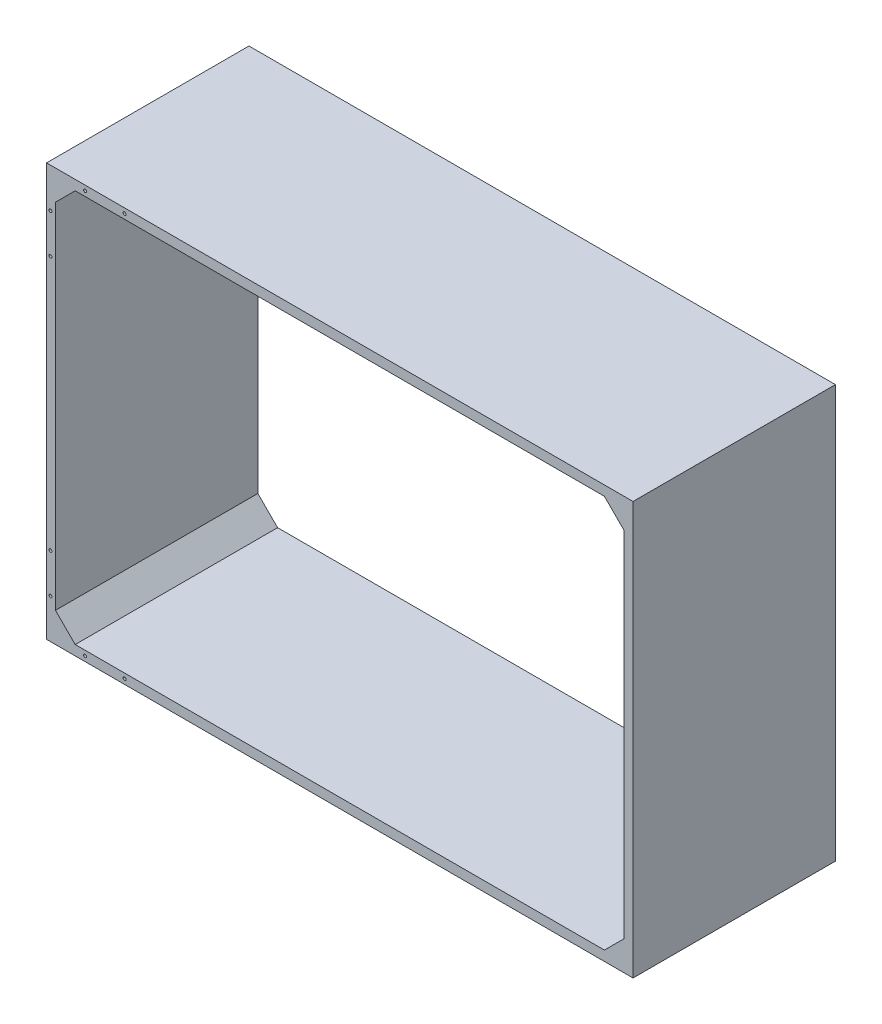
ISO-10303-21;
HEADER;
FILE_DESCRIPTION(('STEP AP214'),'2;1');
FILE_NAME('part.step','',(''),(''),'','','');
FILE_SCHEMA(('AUTOMOTIVE_DESIGN { 1 0 10303 214 1 1 1 1 }'));
ENDSEC;
DATA;
#1=APPLICATION_CONTEXT('core data for automotive mechanical design processes');
#2=APPLICATION_PROTOCOL_DEFINITION('international standard','automotive_design',2000,#1);
#3=PRODUCT_CONTEXT('',#1,'mechanical');
#4=PRODUCT('Part','Part','',(#3));
#5=PRODUCT_RELATED_PRODUCT_CATEGORY('part','',(#4));
#6=PRODUCT_DEFINITION_FORMATION('','',#4);
#7=PRODUCT_DEFINITION_CONTEXT('part definition',#1,'design');
#8=PRODUCT_DEFINITION('design','',#6,#7);
#9=PRODUCT_DEFINITION_SHAPE('','',#8);
#10=(LENGTH_UNIT() NAMED_UNIT(*) SI_UNIT(.MILLI.,.METRE.));
#11=(NAMED_UNIT(*) PLANE_ANGLE_UNIT() SI_UNIT($,.RADIAN.));
#12=(NAMED_UNIT(*) SI_UNIT($,.STERADIAN.) SOLID_ANGLE_UNIT());
#13=UNCERTAINTY_MEASURE_WITH_UNIT(LENGTH_MEASURE(1.E-05),#10,'distance_accuracy_value','');
#14=(GEOMETRIC_REPRESENTATION_CONTEXT(3) GLOBAL_UNCERTAINTY_ASSIGNED_CONTEXT((#13)) GLOBAL_UNIT_ASSIGNED_CONTEXT((#10,
#11,#12)) REPRESENTATION_CONTEXT('',''));
#15=CARTESIAN_POINT('',(0.,0.,0.));
#16=DIRECTION('',(0.,0.,1.));
#17=DIRECTION('',(1.,0.,0.));
#18=AXIS2_PLACEMENT_3D('',#15,#16,#17);
#19=CARTESIAN_POINT('',(-297.,-209.,0.));
#20=DIRECTION('',(-1.,0.,0.));
#21=DIRECTION('',(0.,0.,1.));
#22=AXIS2_PLACEMENT_3D('',#19,#20,#21);
#23=PLANE('',#22);
#24=DIRECTION('',(0.,1.,0.));
#25=VECTOR('',#24,1.);
#26=CARTESIAN_POINT('',(-297.,-209.,-205.));
#27=LINE('',#26,#25);
#28=CARTESIAN_POINT('',(-297.,-209.,-205.));
#29=VERTEX_POINT('',#28);
#30=CARTESIAN_POINT('',(-297.,209.,-205.));
#31=VERTEX_POINT('',#30);
#32=EDGE_CURVE('E213',#29,#31,#27,.T.);
#33=ORIENTED_EDGE('',*,*,#32,.F.);
#34=DIRECTION('',(0.,0.,-1.));
#35=VECTOR('',#34,1.);
#36=CARTESIAN_POINT('',(-297.,-209.,0.));
#37=LINE('',#36,#35);
#38=CARTESIAN_POINT('',(-297.,-209.,0.));
#39=VERTEX_POINT('',#38);
#40=EDGE_CURVE('E247',#39,#29,#37,.T.);
#41=ORIENTED_EDGE('',*,*,#40,.F.);
#42=DIRECTION('',(0.,1.,0.));
#43=VECTOR('',#42,1.);
#44=CARTESIAN_POINT('',(-297.,-209.,0.));
#45=LINE('',#44,#43);
#46=CARTESIAN_POINT('',(-297.,209.,0.));
#47=VERTEX_POINT('',#46);
#48=EDGE_CURVE('E223',#39,#47,#45,.T.);
#49=ORIENTED_EDGE('',*,*,#48,.T.);
#50=DIRECTION('',(0.,0.,-1.));
#51=VECTOR('',#50,1.);
#52=CARTESIAN_POINT('',(-297.,209.,0.));
#53=LINE('',#52,#51);
#54=EDGE_CURVE('E236',#47,#31,#53,.T.);
#55=ORIENTED_EDGE('',*,*,#54,.T.);
#56=EDGE_LOOP('',(#33,#41,#49,#55));
#57=FACE_BOUND('',#56,.T.);
#58=ADVANCED_FACE('F33',(#57),#23,.T.);
#59=CARTESIAN_POINT('',(297.,-209.,0.));
#60=DIRECTION('',(0.,-1.,0.));
#61=DIRECTION('',(1.,0.,0.));
#62=AXIS2_PLACEMENT_3D('',#59,#60,#61);
#63=PLANE('',#62);
#64=DIRECTION('',(-1.,0.,0.));
#65=VECTOR('',#64,1.);
#66=CARTESIAN_POINT('',(297.,-209.,-205.));
#67=LINE('',#66,#65);
#68=CARTESIAN_POINT('',(297.,-209.,-205.));
#69=VERTEX_POINT('',#68);
#70=EDGE_CURVE('E227',#69,#29,#67,.T.);
#71=ORIENTED_EDGE('',*,*,#70,.F.);
#72=DIRECTION('',(0.,0.,-1.));
#73=VECTOR('',#72,1.);
#74=CARTESIAN_POINT('',(297.,-209.,0.));
#75=LINE('',#74,#73);
#76=CARTESIAN_POINT('',(297.,-209.,0.));
#77=VERTEX_POINT('',#76);
#78=EDGE_CURVE('E250',#77,#69,#75,.T.);
#79=ORIENTED_EDGE('',*,*,#78,.F.);
#80=DIRECTION('',(-1.,0.,0.));
#81=VECTOR('',#80,1.);
#82=CARTESIAN_POINT('',(297.,-209.,0.));
#83=LINE('',#82,#81);
#84=EDGE_CURVE('E233',#77,#39,#83,.T.);
#85=ORIENTED_EDGE('',*,*,#84,.T.);
#86=ORIENTED_EDGE('',*,*,#40,.T.);
#87=EDGE_LOOP('',(#71,#79,#85,#86));
#88=FACE_BOUND('',#87,.T.);
#89=ADVANCED_FACE('F328',(#88),#63,.T.);
#90=CARTESIAN_POINT('',(297.,209.,0.));
#91=DIRECTION('',(1.,0.,0.));
#92=DIRECTION('',(0.,0.,-1.));
#93=AXIS2_PLACEMENT_3D('',#90,#91,#92);
#94=PLANE('',#93);
#95=DIRECTION('',(0.,-1.,0.));
#96=VECTOR('',#95,1.);
#97=CARTESIAN_POINT('',(297.,209.,-205.));
#98=LINE('',#97,#96);
#99=CARTESIAN_POINT('',(297.,209.,-205.));
#100=VERTEX_POINT('',#99);
#101=EDGE_CURVE('E242',#100,#69,#98,.T.);
#102=ORIENTED_EDGE('',*,*,#101,.F.);
#103=DIRECTION('',(0.,0.,-1.));
#104=VECTOR('',#103,1.);
#105=CARTESIAN_POINT('',(297.,209.,0.));
#106=LINE('',#105,#104);
#107=CARTESIAN_POINT('',(297.,209.,0.));
#108=VERTEX_POINT('',#107);
#109=EDGE_CURVE('E252',#108,#100,#106,.T.);
#110=ORIENTED_EDGE('',*,*,#109,.F.);
#111=DIRECTION('',(0.,-1.,0.));
#112=VECTOR('',#111,1.);
#113=CARTESIAN_POINT('',(297.,209.,0.));
#114=LINE('',#113,#112);
#115=EDGE_CURVE('E230',#108,#77,#114,.T.);
#116=ORIENTED_EDGE('',*,*,#115,.T.);
#117=ORIENTED_EDGE('',*,*,#78,.T.);
#118=EDGE_LOOP('',(#102,#110,#116,#117));
#119=FACE_BOUND('',#118,.T.);
#120=ADVANCED_FACE('F334',(#119),#94,.T.);
#121=CARTESIAN_POINT('',(-297.,209.,0.));
#122=DIRECTION('',(0.,1.,0.));
#123=DIRECTION('',(-1.,0.,0.));
#124=AXIS2_PLACEMENT_3D('',#121,#122,#123);
#125=PLANE('',#124);
#126=DIRECTION('',(1.,0.,0.));
#127=VECTOR('',#126,1.);
#128=CARTESIAN_POINT('',(-297.,209.,-205.));
#129=LINE('',#128,#127);
#130=EDGE_CURVE('E239',#31,#100,#129,.T.);
#131=ORIENTED_EDGE('',*,*,#130,.F.);
#132=ORIENTED_EDGE('',*,*,#54,.F.);
#133=DIRECTION('',(1.,0.,0.));
#134=VECTOR('',#133,1.);
#135=CARTESIAN_POINT('',(-297.,209.,0.));
#136=LINE('',#135,#134);
#137=EDGE_CURVE('E226',#47,#108,#136,.T.);
#138=ORIENTED_EDGE('',*,*,#137,.T.);
#139=ORIENTED_EDGE('',*,*,#109,.T.);
#140=EDGE_LOOP('',(#131,#132,#138,#139));
#141=FACE_BOUND('',#140,.T.);
#142=ADVANCED_FACE('F339',(#141),#125,.T.);
#143=CARTESIAN_POINT('',(0.,0.,0.));
#144=DIRECTION('',(0.,0.,-1.));
#145=DIRECTION('',(-1.,0.,0.));
#146=AXIS2_PLACEMENT_3D('',#143,#144,#145);
#147=PLANE('',#146);
#148=CARTESIAN_POINT('',(-293.,-169.,0.));
#149=DIRECTION('',(0.,0.,1.));
#150=DIRECTION('',(1.,0.,0.));
#151=AXIS2_PLACEMENT_3D('',#148,#149,#150);
#152=CIRCLE('',#151,1.5);
#153=CARTESIAN_POINT('',(-291.5,-169.,0.));
#154=VERTEX_POINT('',#153);
#155=EDGE_CURVE('E155',#154,#154,#152,.T.);
#156=ORIENTED_EDGE('',*,*,#155,.F.);
#157=EDGE_LOOP('',(#156));
#158=FACE_BOUND('',#157,.T.);
#159=CARTESIAN_POINT('',(-293.,-129.,0.));
#160=DIRECTION('',(0.,0.,1.));
#161=DIRECTION('',(1.,0.,0.));
#162=AXIS2_PLACEMENT_3D('',#159,#160,#161);
#163=CIRCLE('',#162,1.5);
#164=CARTESIAN_POINT('',(-291.5,-129.,0.));
#165=VERTEX_POINT('',#164);
#166=EDGE_CURVE('E154',#165,#165,#163,.T.);
#167=ORIENTED_EDGE('',*,*,#166,.F.);
#168=EDGE_LOOP('',(#167));
#169=FACE_BOUND('',#168,.T.);
#170=CARTESIAN_POINT('',(-258.,204.,0.));
#171=DIRECTION('',(0.,0.,1.));
#172=DIRECTION('',(1.,0.,0.));
#173=AXIS2_PLACEMENT_3D('',#170,#171,#172);
#174=CIRCLE('',#173,1.5);
#175=CARTESIAN_POINT('',(-256.5,204.,0.));
#176=VERTEX_POINT('',#175);
#177=EDGE_CURVE('E165',#176,#176,#174,.T.);
#178=ORIENTED_EDGE('',*,*,#177,.F.);
#179=EDGE_LOOP('',(#178));
#180=FACE_BOUND('',#179,.T.);
#181=CARTESIAN_POINT('',(-293.,169.,0.));
#182=DIRECTION('',(0.,0.,1.));
#183=DIRECTION('',(1.,0.,0.));
#184=AXIS2_PLACEMENT_3D('',#181,#182,#183);
#185=CIRCLE('',#184,1.5);
#186=CARTESIAN_POINT('',(-291.5,169.,0.));
#187=VERTEX_POINT('',#186);
#188=EDGE_CURVE('E171',#187,#187,#185,.T.);
#189=ORIENTED_EDGE('',*,*,#188,.F.);
#190=EDGE_LOOP('',(#189));
#191=FACE_BOUND('',#190,.T.);
#192=CARTESIAN_POINT('',(-293.,129.,0.));
#193=DIRECTION('',(0.,0.,1.));
#194=DIRECTION('',(1.,0.,0.));
#195=AXIS2_PLACEMENT_3D('',#192,#193,#194);
#196=CIRCLE('',#195,1.5);
#197=CARTESIAN_POINT('',(-291.5,129.,0.));
#198=VERTEX_POINT('',#197);
#199=EDGE_CURVE('E177',#198,#198,#196,.T.);
#200=ORIENTED_EDGE('',*,*,#199,.F.);
#201=EDGE_LOOP('',(#200));
#202=FACE_BOUND('',#201,.T.);
#203=CARTESIAN_POINT('',(-218.,204.,0.));
#204=DIRECTION('',(0.,0.,1.));
#205=DIRECTION('',(1.,0.,0.));
#206=AXIS2_PLACEMENT_3D('',#203,#204,#205);
#207=CIRCLE('',#206,1.5);
#208=CARTESIAN_POINT('',(-216.5,204.,0.));
#209=VERTEX_POINT('',#208);
#210=EDGE_CURVE('E183',#209,#209,#207,.T.);
#211=ORIENTED_EDGE('',*,*,#210,.F.);
#212=EDGE_LOOP('',(#211));
#213=FACE_BOUND('',#212,.T.);
#214=CARTESIAN_POINT('',(-258.,-204.,0.));
#215=DIRECTION('',(0.,0.,1.));
#216=DIRECTION('',(1.,0.,0.));
#217=AXIS2_PLACEMENT_3D('',#214,#215,#216);
#218=CIRCLE('',#217,1.5);
#219=CARTESIAN_POINT('',(-256.5,-204.,0.));
#220=VERTEX_POINT('',#219);
#221=EDGE_CURVE('E189',#220,#220,#218,.T.);
#222=ORIENTED_EDGE('',*,*,#221,.F.);
#223=EDGE_LOOP('',(#222));
#224=FACE_BOUND('',#223,.T.);
#225=CARTESIAN_POINT('',(-218.,-204.,0.));
#226=DIRECTION('',(0.,0.,1.));
#227=DIRECTION('',(1.,0.,0.));
#228=AXIS2_PLACEMENT_3D('',#225,#226,#227);
#229=CIRCLE('',#228,1.5);
#230=CARTESIAN_POINT('',(-216.5,-204.,0.));
#231=VERTEX_POINT('',#230);
#232=EDGE_CURVE('E195',#231,#231,#229,.T.);
#233=ORIENTED_EDGE('',*,*,#232,.F.);
#234=EDGE_LOOP('',(#233));
#235=FACE_BOUND('',#234,.T.);
#236=DIRECTION('',(-1.,0.,0.));
#237=VECTOR('',#236,1.);
#238=CARTESIAN_POINT('',(288.,199.,0.));
#239=LINE('',#238,#237);
#240=CARTESIAN_POINT('',(268.,199.,0.));
#241=VERTEX_POINT('',#240);
#242=CARTESIAN_POINT('',(-268.,199.,0.));
#243=VERTEX_POINT('',#242);
#244=EDGE_CURVE('E216',#241,#243,#239,.T.);
#245=ORIENTED_EDGE('',*,*,#244,.F.);
#246=DIRECTION('',(-0.707106781186549,0.707106781186546,0.));
#247=VECTOR('',#246,1.);
#248=CARTESIAN_POINT('',(233.499999999999,233.500000000001,0.));
#249=LINE('',#248,#247);
#250=CARTESIAN_POINT('',(288.,179.,0.));
#251=VERTEX_POINT('',#250);
#252=EDGE_CURVE('E277',#241,#251,#249,.F.);
#253=ORIENTED_EDGE('',*,*,#252,.T.);
#254=DIRECTION('',(0.,1.,0.));
#255=VECTOR('',#254,1.);
#256=CARTESIAN_POINT('',(288.,-199.,0.));
#257=LINE('',#256,#255);
#258=CARTESIAN_POINT('',(288.,-179.,0.));
#259=VERTEX_POINT('',#258);
#260=EDGE_CURVE('E201',#259,#251,#257,.T.);
#261=ORIENTED_EDGE('',*,*,#260,.F.);
#262=DIRECTION('',(0.707106781186544,0.707106781186551,0.));
#263=VECTOR('',#262,1.);
#264=CARTESIAN_POINT('',(233.500000000002,-233.499999999999,0.));
#265=LINE('',#264,#263);
#266=CARTESIAN_POINT('',(268.,-199.,0.));
#267=VERTEX_POINT('',#266);
#268=EDGE_CURVE('E273',#259,#267,#265,.F.);
#269=ORIENTED_EDGE('',*,*,#268,.T.);
#270=DIRECTION('',(1.,0.,0.));
#271=VECTOR('',#270,1.);
#272=CARTESIAN_POINT('',(-288.,-199.,0.));
#273=LINE('',#272,#271);
#274=CARTESIAN_POINT('',(-268.,-199.,0.));
#275=VERTEX_POINT('',#274);
#276=EDGE_CURVE('E206',#275,#267,#273,.T.);
#277=ORIENTED_EDGE('',*,*,#276,.F.);
#278=DIRECTION('',(0.707106781186549,-0.707106781186546,0.));
#279=VECTOR('',#278,1.);
#280=CARTESIAN_POINT('',(-233.499999999999,-233.500000000001,0.));
#281=LINE('',#280,#279);
#282=CARTESIAN_POINT('',(-288.,-179.,0.));
#283=VERTEX_POINT('',#282);
#284=EDGE_CURVE('E281',#275,#283,#281,.F.);
#285=ORIENTED_EDGE('',*,*,#284,.T.);
#286=DIRECTION('',(0.,-1.,0.));
#287=VECTOR('',#286,1.);
#288=CARTESIAN_POINT('',(-288.,199.,0.));
#289=LINE('',#288,#287);
#290=CARTESIAN_POINT('',(-288.,179.,0.));
#291=VERTEX_POINT('',#290);
#292=EDGE_CURVE('E219',#291,#283,#289,.T.);
#293=ORIENTED_EDGE('',*,*,#292,.F.);
#294=DIRECTION('',(-0.707106781186544,-0.707106781186551,0.));
#295=VECTOR('',#294,1.);
#296=CARTESIAN_POINT('',(-233.500000000002,233.499999999999,0.));
#297=LINE('',#296,#295);
#298=EDGE_CURVE('E41',#291,#243,#297,.F.);
#299=ORIENTED_EDGE('',*,*,#298,.T.);
#300=EDGE_LOOP('',(#245,#253,#261,#269,#277,#285,#293,#299));
#301=FACE_BOUND('',#300,.T.);
#302=ORIENTED_EDGE('',*,*,#48,.F.);
#303=ORIENTED_EDGE('',*,*,#84,.F.);
#304=ORIENTED_EDGE('',*,*,#115,.F.);
#305=ORIENTED_EDGE('',*,*,#137,.F.);
#306=EDGE_LOOP('',(#302,#303,#304,#305));
#307=FACE_BOUND('',#306,.T.);
#308=ADVANCED_FACE('F287',(#158,#169,#180,#191,#202,#213,#224,#235,#301,#307),#147,.F.);
#309=CARTESIAN_POINT('',(0.,0.,-205.));
#310=DIRECTION('',(0.,0.,-1.));
#311=DIRECTION('',(-1.,0.,0.));
#312=AXIS2_PLACEMENT_3D('',#309,#310,#311);
#313=PLANE('',#312);
#314=DIRECTION('',(1.,0.,0.));
#315=VECTOR('',#314,1.);
#316=CARTESIAN_POINT('',(-288.,-199.,-205.));
#317=LINE('',#316,#315);
#318=CARTESIAN_POINT('',(-268.,-199.,-205.));
#319=VERTEX_POINT('',#318);
#320=CARTESIAN_POINT('',(268.,-199.,-205.));
#321=VERTEX_POINT('',#320);
#322=EDGE_CURVE('E210',#319,#321,#317,.T.);
#323=ORIENTED_EDGE('',*,*,#322,.T.);
#324=DIRECTION('',(-0.707106781186544,-0.707106781186551,0.));
#325=VECTOR('',#324,1.);
#326=CARTESIAN_POINT('',(288.,-179.,-205.));
#327=LINE('',#326,#325);
#328=CARTESIAN_POINT('',(288.,-179.,-205.));
#329=VERTEX_POINT('',#328);
#330=EDGE_CURVE('E275',#321,#329,#327,.F.);
#331=ORIENTED_EDGE('',*,*,#330,.T.);
#332=DIRECTION('',(0.,1.,0.));
#333=VECTOR('',#332,1.);
#334=CARTESIAN_POINT('',(288.,-199.,-205.));
#335=LINE('',#334,#333);
#336=CARTESIAN_POINT('',(288.,179.,-205.));
#337=VERTEX_POINT('',#336);
#338=EDGE_CURVE('E202',#329,#337,#335,.T.);
#339=ORIENTED_EDGE('',*,*,#338,.T.);
#340=DIRECTION('',(0.707106781186549,-0.707106781186546,0.));
#341=VECTOR('',#340,1.);
#342=CARTESIAN_POINT('',(268.,199.,-205.));
#343=LINE('',#342,#341);
#344=CARTESIAN_POINT('',(268.,199.,-205.));
#345=VERTEX_POINT('',#344);
#346=EDGE_CURVE('E279',#337,#345,#343,.F.);
#347=ORIENTED_EDGE('',*,*,#346,.T.);
#348=DIRECTION('',(-1.,0.,0.));
#349=VECTOR('',#348,1.);
#350=CARTESIAN_POINT('',(288.,199.,-205.));
#351=LINE('',#350,#349);
#352=CARTESIAN_POINT('',(-268.,199.,-205.));
#353=VERTEX_POINT('',#352);
#354=EDGE_CURVE('E205',#345,#353,#351,.T.);
#355=ORIENTED_EDGE('',*,*,#354,.T.);
#356=DIRECTION('',(0.707106781186544,0.707106781186551,0.));
#357=VECTOR('',#356,1.);
#358=CARTESIAN_POINT('',(-288.,179.,-205.));
#359=LINE('',#358,#357);
#360=CARTESIAN_POINT('',(-288.,179.,-205.));
#361=VERTEX_POINT('',#360);
#362=EDGE_CURVE('E11',#353,#361,#359,.F.);
#363=ORIENTED_EDGE('',*,*,#362,.T.);
#364=DIRECTION('',(0.,-1.,0.));
#365=VECTOR('',#364,1.);
#366=CARTESIAN_POINT('',(-288.,199.,-205.));
#367=LINE('',#366,#365);
#368=CARTESIAN_POINT('',(-288.,-179.,-205.));
#369=VERTEX_POINT('',#368);
#370=EDGE_CURVE('E208',#361,#369,#367,.T.);
#371=ORIENTED_EDGE('',*,*,#370,.T.);
#372=DIRECTION('',(-0.707106781186549,0.707106781186546,0.));
#373=VECTOR('',#372,1.);
#374=CARTESIAN_POINT('',(-268.,-199.,-205.));
#375=LINE('',#374,#373);
#376=EDGE_CURVE('E283',#369,#319,#375,.F.);
#377=ORIENTED_EDGE('',*,*,#376,.T.);
#378=EDGE_LOOP('',(#323,#331,#339,#347,#355,#363,#371,#377));
#379=FACE_BOUND('',#378,.T.);
#380=ORIENTED_EDGE('',*,*,#32,.T.);
#381=ORIENTED_EDGE('',*,*,#130,.T.);
#382=ORIENTED_EDGE('',*,*,#101,.T.);
#383=ORIENTED_EDGE('',*,*,#70,.T.);
#384=EDGE_LOOP('',(#380,#381,#382,#383));
#385=FACE_BOUND('',#384,.T.);
#386=ADVANCED_FACE('F298',(#379,#385),#313,.T.);
#387=CARTESIAN_POINT('',(288.,-199.,-205.));
#388=DIRECTION('',(1.,0.,0.));
#389=DIRECTION('',(0.,0.,-1.));
#390=AXIS2_PLACEMENT_3D('',#387,#388,#389);
#391=PLANE('',#390);
#392=ORIENTED_EDGE('',*,*,#338,.F.);
#393=DIRECTION('',(0.,0.,1.));
#394=VECTOR('',#393,1.);
#395=CARTESIAN_POINT('',(288.,-179.,0.));
#396=LINE('',#395,#394);
#397=EDGE_CURVE('E256',#329,#259,#396,.T.);
#398=ORIENTED_EDGE('',*,*,#397,.T.);
#399=ORIENTED_EDGE('',*,*,#260,.T.);
#400=DIRECTION('',(0.,0.,-1.));
#401=VECTOR('',#400,1.);
#402=CARTESIAN_POINT('',(288.,179.,-205.));
#403=LINE('',#402,#401);
#404=EDGE_CURVE('E249',#251,#337,#403,.T.);
#405=ORIENTED_EDGE('',*,*,#404,.T.);
#406=EDGE_LOOP('',(#392,#398,#399,#405));
#407=FACE_BOUND('',#406,.T.);
#408=ADVANCED_FACE('F315',(#407),#391,.F.);
#409=CARTESIAN_POINT('',(-288.,-199.,-205.));
#410=DIRECTION('',(0.,-1.,0.));
#411=DIRECTION('',(0.,0.,-1.));
#412=AXIS2_PLACEMENT_3D('',#409,#410,#411);
#413=PLANE('',#412);
#414=ORIENTED_EDGE('',*,*,#276,.T.);
#415=DIRECTION('',(0.,0.,-1.));
#416=VECTOR('',#415,1.);
#417=CARTESIAN_POINT('',(268.,-199.,-205.));
#418=LINE('',#417,#416);
#419=EDGE_CURVE('E262',#267,#321,#418,.T.);
#420=ORIENTED_EDGE('',*,*,#419,.T.);
#421=ORIENTED_EDGE('',*,*,#322,.F.);
#422=DIRECTION('',(0.,0.,1.));
#423=VECTOR('',#422,1.);
#424=CARTESIAN_POINT('',(-268.,-199.,0.));
#425=LINE('',#424,#423);
#426=EDGE_CURVE('E259',#319,#275,#425,.T.);
#427=ORIENTED_EDGE('',*,*,#426,.T.);
#428=EDGE_LOOP('',(#414,#420,#421,#427));
#429=FACE_BOUND('',#428,.T.);
#430=ADVANCED_FACE('F306',(#429),#413,.F.);
#431=CARTESIAN_POINT('',(-288.,199.,-205.));
#432=DIRECTION('',(-1.,0.,0.));
#433=DIRECTION('',(0.,0.,1.));
#434=AXIS2_PLACEMENT_3D('',#431,#432,#433);
#435=PLANE('',#434);
#436=ORIENTED_EDGE('',*,*,#292,.T.);
#437=DIRECTION('',(0.,0.,-1.));
#438=VECTOR('',#437,1.);
#439=CARTESIAN_POINT('',(-288.,-179.,-205.));
#440=LINE('',#439,#438);
#441=EDGE_CURVE('E48',#283,#369,#440,.T.);
#442=ORIENTED_EDGE('',*,*,#441,.T.);
#443=ORIENTED_EDGE('',*,*,#370,.F.);
#444=DIRECTION('',(0.,0.,1.));
#445=VECTOR('',#444,1.);
#446=CARTESIAN_POINT('',(-288.,179.,0.));
#447=LINE('',#446,#445);
#448=EDGE_CURVE('E269',#361,#291,#447,.T.);
#449=ORIENTED_EDGE('',*,*,#448,.T.);
#450=EDGE_LOOP('',(#436,#442,#443,#449));
#451=FACE_BOUND('',#450,.T.);
#452=ADVANCED_FACE('F296',(#451),#435,.F.);
#453=CARTESIAN_POINT('',(288.,199.,-205.));
#454=DIRECTION('',(0.,1.,0.));
#455=DIRECTION('',(0.,0.,1.));
#456=AXIS2_PLACEMENT_3D('',#453,#454,#455);
#457=PLANE('',#456);
#458=ORIENTED_EDGE('',*,*,#354,.F.);
#459=DIRECTION('',(0.,0.,1.));
#460=VECTOR('',#459,1.);
#461=CARTESIAN_POINT('',(268.,199.,0.));
#462=LINE('',#461,#460);
#463=EDGE_CURVE('E266',#345,#241,#462,.T.);
#464=ORIENTED_EDGE('',*,*,#463,.T.);
#465=ORIENTED_EDGE('',*,*,#244,.T.);
#466=DIRECTION('',(0.,0.,-1.));
#467=VECTOR('',#466,1.);
#468=CARTESIAN_POINT('',(-268.,199.,-205.));
#469=LINE('',#468,#467);
#470=EDGE_CURVE('E264',#243,#353,#469,.T.);
#471=ORIENTED_EDGE('',*,*,#470,.T.);
#472=EDGE_LOOP('',(#458,#464,#465,#471));
#473=FACE_BOUND('',#472,.T.);
#474=ADVANCED_FACE('F294',(#473),#457,.F.);
#475=CARTESIAN_POINT('',(-218.,-204.,-14.09870907145));
#476=DIRECTION('',(0.,0.,1.));
#477=DIRECTION('',(1.,0.,0.));
#478=AXIS2_PLACEMENT_3D('',#475,#476,#477);
#479=CONICAL_SURFACE('',#478,1.5,1.02974425866368);
#480=CARTESIAN_POINT('',(-218.,-204.,-15.0000000000178));
#481=VERTEX_POINT('',#480);
#482=VERTEX_LOOP('',#481);
#483=FACE_BOUND('',#482,.T.);
#484=CARTESIAN_POINT('',(-218.,-204.,-14.09870907145));
#485=DIRECTION('',(0.,0.,1.));
#486=DIRECTION('',(1.,0.,0.));
#487=AXIS2_PLACEMENT_3D('',#484,#485,#486);
#488=CIRCLE('',#487,1.5);
#489=CARTESIAN_POINT('',(-216.5,-204.,-14.09870907145));
#490=VERTEX_POINT('',#489);
#491=EDGE_CURVE('E198',#490,#490,#488,.T.);
#492=ORIENTED_EDGE('',*,*,#491,.T.);
#493=EDGE_LOOP('',(#492));
#494=FACE_BOUND('',#493,.T.);
#495=ADVANCED_FACE('F355',(#483,#494),#479,.F.);
#496=CARTESIAN_POINT('',(-218.,-204.,0.));
#497=DIRECTION('',(0.,0.,1.));
#498=DIRECTION('',(1.,0.,0.));
#499=AXIS2_PLACEMENT_3D('',#496,#497,#498);
#500=CYLINDRICAL_SURFACE('',#499,1.5);
#501=ORIENTED_EDGE('',*,*,#491,.F.);
#502=EDGE_LOOP('',(#501));
#503=FACE_BOUND('',#502,.T.);
#504=ORIENTED_EDGE('',*,*,#232,.T.);
#505=EDGE_LOOP('',(#504));
#506=FACE_BOUND('',#505,.T.);
#507=ADVANCED_FACE('F362',(#503,#506),#500,.F.);
#508=CARTESIAN_POINT('',(-258.,-204.,-14.09870907145));
#509=DIRECTION('',(0.,0.,1.));
#510=DIRECTION('',(1.,0.,0.));
#511=AXIS2_PLACEMENT_3D('',#508,#509,#510);
#512=CONICAL_SURFACE('',#511,1.5,1.02974425866368);
#513=CARTESIAN_POINT('',(-258.,-204.,-15.0000000000178));
#514=VERTEX_POINT('',#513);
#515=VERTEX_LOOP('',#514);
#516=FACE_BOUND('',#515,.T.);
#517=CARTESIAN_POINT('',(-258.,-204.,-14.09870907145));
#518=DIRECTION('',(0.,0.,1.));
#519=DIRECTION('',(1.,0.,0.));
#520=AXIS2_PLACEMENT_3D('',#517,#518,#519);
#521=CIRCLE('',#520,1.5);
#522=CARTESIAN_POINT('',(-256.5,-204.,-14.09870907145));
#523=VERTEX_POINT('',#522);
#524=EDGE_CURVE('E192',#523,#523,#521,.T.);
#525=ORIENTED_EDGE('',*,*,#524,.T.);
#526=EDGE_LOOP('',(#525));
#527=FACE_BOUND('',#526,.T.);
#528=ADVANCED_FACE('F366',(#516,#527),#512,.F.);
#529=CARTESIAN_POINT('',(-258.,-204.,0.));
#530=DIRECTION('',(0.,0.,1.));
#531=DIRECTION('',(1.,0.,0.));
#532=AXIS2_PLACEMENT_3D('',#529,#530,#531);
#533=CYLINDRICAL_SURFACE('',#532,1.5);
#534=ORIENTED_EDGE('',*,*,#524,.F.);
#535=EDGE_LOOP('',(#534));
#536=FACE_BOUND('',#535,.T.);
#537=ORIENTED_EDGE('',*,*,#221,.T.);
#538=EDGE_LOOP('',(#537));
#539=FACE_BOUND('',#538,.T.);
#540=ADVANCED_FACE('F370',(#536,#539),#533,.F.);
#541=CARTESIAN_POINT('',(-218.,204.,-14.09870907145));
#542=DIRECTION('',(0.,0.,1.));
#543=DIRECTION('',(1.,0.,0.));
#544=AXIS2_PLACEMENT_3D('',#541,#542,#543);
#545=CONICAL_SURFACE('',#544,1.5,1.02974425866368);
#546=CARTESIAN_POINT('',(-218.,204.,-15.0000000000178));
#547=VERTEX_POINT('',#546);
#548=VERTEX_LOOP('',#547);
#549=FACE_BOUND('',#548,.T.);
#550=CARTESIAN_POINT('',(-218.,204.,-14.09870907145));
#551=DIRECTION('',(0.,0.,1.));
#552=DIRECTION('',(1.,0.,0.));
#553=AXIS2_PLACEMENT_3D('',#550,#551,#552);
#554=CIRCLE('',#553,1.5);
#555=CARTESIAN_POINT('',(-216.5,204.,-14.09870907145));
#556=VERTEX_POINT('',#555);
#557=EDGE_CURVE('E186',#556,#556,#554,.T.);
#558=ORIENTED_EDGE('',*,*,#557,.T.);
#559=EDGE_LOOP('',(#558));
#560=FACE_BOUND('',#559,.T.);
#561=ADVANCED_FACE('F374',(#549,#560),#545,.F.);
#562=CARTESIAN_POINT('',(-218.,204.,0.));
#563=DIRECTION('',(0.,0.,1.));
#564=DIRECTION('',(1.,0.,0.));
#565=AXIS2_PLACEMENT_3D('',#562,#563,#564);
#566=CYLINDRICAL_SURFACE('',#565,1.5);
#567=ORIENTED_EDGE('',*,*,#557,.F.);
#568=EDGE_LOOP('',(#567));
#569=FACE_BOUND('',#568,.T.);
#570=ORIENTED_EDGE('',*,*,#210,.T.);
#571=EDGE_LOOP('',(#570));
#572=FACE_BOUND('',#571,.T.);
#573=ADVANCED_FACE('F378',(#569,#572),#566,.F.);
#574=CARTESIAN_POINT('',(-293.,129.,-14.09870907145));
#575=DIRECTION('',(0.,0.,1.));
#576=DIRECTION('',(1.,0.,0.));
#577=AXIS2_PLACEMENT_3D('',#574,#575,#576);
#578=CONICAL_SURFACE('',#577,1.5,1.02974425866368);
#579=CARTESIAN_POINT('',(-293.,129.,-15.0000000000178));
#580=VERTEX_POINT('',#579);
#581=VERTEX_LOOP('',#580);
#582=FACE_BOUND('',#581,.T.);
#583=CARTESIAN_POINT('',(-293.,129.,-14.09870907145));
#584=DIRECTION('',(0.,0.,1.));
#585=DIRECTION('',(1.,0.,0.));
#586=AXIS2_PLACEMENT_3D('',#583,#584,#585);
#587=CIRCLE('',#586,1.5);
#588=CARTESIAN_POINT('',(-291.5,129.,-14.09870907145));
#589=VERTEX_POINT('',#588);
#590=EDGE_CURVE('E180',#589,#589,#587,.T.);
#591=ORIENTED_EDGE('',*,*,#590,.T.);
#592=EDGE_LOOP('',(#591));
#593=FACE_BOUND('',#592,.T.);
#594=ADVANCED_FACE('F382',(#582,#593),#578,.F.);
#595=CARTESIAN_POINT('',(-293.,129.,0.));
#596=DIRECTION('',(0.,0.,1.));
#597=DIRECTION('',(1.,0.,0.));
#598=AXIS2_PLACEMENT_3D('',#595,#596,#597);
#599=CYLINDRICAL_SURFACE('',#598,1.5);
#600=ORIENTED_EDGE('',*,*,#590,.F.);
#601=EDGE_LOOP('',(#600));
#602=FACE_BOUND('',#601,.T.);
#603=ORIENTED_EDGE('',*,*,#199,.T.);
#604=EDGE_LOOP('',(#603));
#605=FACE_BOUND('',#604,.T.);
#606=ADVANCED_FACE('F386',(#602,#605),#599,.F.);
#607=CARTESIAN_POINT('',(-293.,169.,-14.09870907145));
#608=DIRECTION('',(0.,0.,1.));
#609=DIRECTION('',(1.,0.,0.));
#610=AXIS2_PLACEMENT_3D('',#607,#608,#609);
#611=CONICAL_SURFACE('',#610,1.5,1.02974425866368);
#612=CARTESIAN_POINT('',(-293.,169.,-15.0000000000178));
#613=VERTEX_POINT('',#612);
#614=VERTEX_LOOP('',#613);
#615=FACE_BOUND('',#614,.T.);
#616=CARTESIAN_POINT('',(-293.,169.,-14.09870907145));
#617=DIRECTION('',(0.,0.,1.));
#618=DIRECTION('',(1.,0.,0.));
#619=AXIS2_PLACEMENT_3D('',#616,#617,#618);
#620=CIRCLE('',#619,1.5);
#621=CARTESIAN_POINT('',(-291.5,169.,-14.09870907145));
#622=VERTEX_POINT('',#621);
#623=EDGE_CURVE('E174',#622,#622,#620,.T.);
#624=ORIENTED_EDGE('',*,*,#623,.T.);
#625=EDGE_LOOP('',(#624));
#626=FACE_BOUND('',#625,.T.);
#627=ADVANCED_FACE('F390',(#615,#626),#611,.F.);
#628=CARTESIAN_POINT('',(-293.,169.,0.));
#629=DIRECTION('',(0.,0.,1.));
#630=DIRECTION('',(1.,0.,0.));
#631=AXIS2_PLACEMENT_3D('',#628,#629,#630);
#632=CYLINDRICAL_SURFACE('',#631,1.5);
#633=ORIENTED_EDGE('',*,*,#623,.F.);
#634=EDGE_LOOP('',(#633));
#635=FACE_BOUND('',#634,.T.);
#636=ORIENTED_EDGE('',*,*,#188,.T.);
#637=EDGE_LOOP('',(#636));
#638=FACE_BOUND('',#637,.T.);
#639=ADVANCED_FACE('F394',(#635,#638),#632,.F.);
#640=CARTESIAN_POINT('',(-258.,204.,-14.09870907145));
#641=DIRECTION('',(0.,0.,1.));
#642=DIRECTION('',(1.,0.,0.));
#643=AXIS2_PLACEMENT_3D('',#640,#641,#642);
#644=CONICAL_SURFACE('',#643,1.5,1.02974425866368);
#645=CARTESIAN_POINT('',(-258.,204.,-15.0000000000178));
#646=VERTEX_POINT('',#645);
#647=VERTEX_LOOP('',#646);
#648=FACE_BOUND('',#647,.T.);
#649=CARTESIAN_POINT('',(-258.,204.,-14.09870907145));
#650=DIRECTION('',(0.,0.,1.));
#651=DIRECTION('',(1.,0.,0.));
#652=AXIS2_PLACEMENT_3D('',#649,#650,#651);
#653=CIRCLE('',#652,1.5);
#654=CARTESIAN_POINT('',(-256.5,204.,-14.09870907145));
#655=VERTEX_POINT('',#654);
#656=EDGE_CURVE('E168',#655,#655,#653,.T.);
#657=ORIENTED_EDGE('',*,*,#656,.T.);
#658=EDGE_LOOP('',(#657));
#659=FACE_BOUND('',#658,.T.);
#660=ADVANCED_FACE('F398',(#648,#659),#644,.F.);
#661=CARTESIAN_POINT('',(-258.,204.,0.));
#662=DIRECTION('',(0.,0.,1.));
#663=DIRECTION('',(1.,0.,0.));
#664=AXIS2_PLACEMENT_3D('',#661,#662,#663);
#665=CYLINDRICAL_SURFACE('',#664,1.5);
#666=ORIENTED_EDGE('',*,*,#656,.F.);
#667=EDGE_LOOP('',(#666));
#668=FACE_BOUND('',#667,.T.);
#669=ORIENTED_EDGE('',*,*,#177,.T.);
#670=EDGE_LOOP('',(#669));
#671=FACE_BOUND('',#670,.T.);
#672=ADVANCED_FACE('F402',(#668,#671),#665,.F.);
#673=CARTESIAN_POINT('',(-293.,-129.,-14.09870907145));
#674=DIRECTION('',(0.,0.,1.));
#675=DIRECTION('',(1.,0.,0.));
#676=AXIS2_PLACEMENT_3D('',#673,#674,#675);
#677=CONICAL_SURFACE('',#676,1.5,1.02974425866368);
#678=CARTESIAN_POINT('',(-293.,-129.,-15.0000000000178));
#679=VERTEX_POINT('',#678);
#680=VERTEX_LOOP('',#679);
#681=FACE_BOUND('',#680,.T.);
#682=CARTESIAN_POINT('',(-293.,-129.,-14.09870907145));
#683=DIRECTION('',(0.,0.,1.));
#684=DIRECTION('',(1.,0.,0.));
#685=AXIS2_PLACEMENT_3D('',#682,#683,#684);
#686=CIRCLE('',#685,1.5);
#687=CARTESIAN_POINT('',(-291.5,-129.,-14.09870907145));
#688=VERTEX_POINT('',#687);
#689=EDGE_CURVE('E158',#688,#688,#686,.T.);
#690=ORIENTED_EDGE('',*,*,#689,.T.);
#691=EDGE_LOOP('',(#690));
#692=FACE_BOUND('',#691,.T.);
#693=ADVANCED_FACE('F406',(#681,#692),#677,.F.);
#694=CARTESIAN_POINT('',(-293.,-129.,0.));
#695=DIRECTION('',(0.,0.,1.));
#696=DIRECTION('',(1.,0.,0.));
#697=AXIS2_PLACEMENT_3D('',#694,#695,#696);
#698=CYLINDRICAL_SURFACE('',#697,1.5);
#699=ORIENTED_EDGE('',*,*,#689,.F.);
#700=EDGE_LOOP('',(#699));
#701=FACE_BOUND('',#700,.T.);
#702=ORIENTED_EDGE('',*,*,#166,.T.);
#703=EDGE_LOOP('',(#702));
#704=FACE_BOUND('',#703,.T.);
#705=ADVANCED_FACE('F148',(#701,#704),#698,.F.);
#706=CARTESIAN_POINT('',(-293.,-169.,-14.09870907145));
#707=DIRECTION('',(0.,0.,1.));
#708=DIRECTION('',(1.,0.,0.));
#709=AXIS2_PLACEMENT_3D('',#706,#707,#708);
#710=CONICAL_SURFACE('',#709,1.5,1.02974425866368);
#711=CARTESIAN_POINT('',(-293.,-169.,-15.0000000000178));
#712=VERTEX_POINT('',#711);
#713=VERTEX_LOOP('',#712);
#714=FACE_BOUND('',#713,.T.);
#715=CARTESIAN_POINT('',(-293.,-169.,-14.09870907145));
#716=DIRECTION('',(0.,0.,1.));
#717=DIRECTION('',(1.,0.,0.));
#718=AXIS2_PLACEMENT_3D('',#715,#716,#717);
#719=CIRCLE('',#718,1.5);
#720=CARTESIAN_POINT('',(-291.5,-169.,-14.09870907145));
#721=VERTEX_POINT('',#720);
#722=EDGE_CURVE('E152',#721,#721,#719,.T.);
#723=ORIENTED_EDGE('',*,*,#722,.T.);
#724=EDGE_LOOP('',(#723));
#725=FACE_BOUND('',#724,.T.);
#726=ADVANCED_FACE('F144',(#714,#725),#710,.F.);
#727=CARTESIAN_POINT('',(-293.,-169.,0.));
#728=DIRECTION('',(0.,0.,1.));
#729=DIRECTION('',(1.,0.,0.));
#730=AXIS2_PLACEMENT_3D('',#727,#728,#729);
#731=CYLINDRICAL_SURFACE('',#730,1.5);
#732=ORIENTED_EDGE('',*,*,#722,.F.);
#733=EDGE_LOOP('',(#732));
#734=FACE_BOUND('',#733,.T.);
#735=ORIENTED_EDGE('',*,*,#155,.T.);
#736=EDGE_LOOP('',(#735));
#737=FACE_BOUND('',#736,.T.);
#738=ADVANCED_FACE('F147',(#734,#737),#731,.F.);
#739=CARTESIAN_POINT('',(288.,-179.,-205.));
#740=DIRECTION('',(-0.707106781186551,0.707106781186543,0.));
#741=DIRECTION('',(0.,0.,-1.));
#742=AXIS2_PLACEMENT_3D('',#739,#740,#741);
#743=PLANE('',#742);
#744=ORIENTED_EDGE('',*,*,#330,.F.);
#745=ORIENTED_EDGE('',*,*,#419,.F.);
#746=ORIENTED_EDGE('',*,*,#268,.F.);
#747=ORIENTED_EDGE('',*,*,#397,.F.);
#748=EDGE_LOOP('',(#744,#745,#746,#747));
#749=FACE_BOUND('',#748,.T.);
#750=ADVANCED_FACE('F312',(#749),#743,.T.);
#751=CARTESIAN_POINT('',(268.,199.,-205.));
#752=DIRECTION('',(-0.707106781186546,-0.707106781186549,0.));
#753=DIRECTION('',(0.,0.,-1.));
#754=AXIS2_PLACEMENT_3D('',#751,#752,#753);
#755=PLANE('',#754);
#756=ORIENTED_EDGE('',*,*,#346,.F.);
#757=ORIENTED_EDGE('',*,*,#404,.F.);
#758=ORIENTED_EDGE('',*,*,#252,.F.);
#759=ORIENTED_EDGE('',*,*,#463,.F.);
#760=EDGE_LOOP('',(#756,#757,#758,#759));
#761=FACE_BOUND('',#760,.T.);
#762=ADVANCED_FACE('F319',(#761),#755,.T.);
#763=CARTESIAN_POINT('',(-268.,-199.,-205.));
#764=DIRECTION('',(0.707106781186546,0.707106781186549,0.));
#765=DIRECTION('',(0.,0.,-1.));
#766=AXIS2_PLACEMENT_3D('',#763,#764,#765);
#767=PLANE('',#766);
#768=ORIENTED_EDGE('',*,*,#376,.F.);
#769=ORIENTED_EDGE('',*,*,#441,.F.);
#770=ORIENTED_EDGE('',*,*,#284,.F.);
#771=ORIENTED_EDGE('',*,*,#426,.F.);
#772=EDGE_LOOP('',(#768,#769,#770,#771));
#773=FACE_BOUND('',#772,.T.);
#774=ADVANCED_FACE('F303',(#773),#767,.T.);
#775=CARTESIAN_POINT('',(-288.,179.,-205.));
#776=DIRECTION('',(0.707106781186551,-0.707106781186543,0.));
#777=DIRECTION('',(0.,0.,-1.));
#778=AXIS2_PLACEMENT_3D('',#775,#776,#777);
#779=PLANE('',#778);
#780=ORIENTED_EDGE('',*,*,#362,.F.);
#781=ORIENTED_EDGE('',*,*,#470,.F.);
#782=ORIENTED_EDGE('',*,*,#298,.F.);
#783=ORIENTED_EDGE('',*,*,#448,.F.);
#784=EDGE_LOOP('',(#780,#781,#782,#783));
#785=FACE_BOUND('',#784,.T.);
#786=ADVANCED_FACE('F35',(#785),#779,.T.);
#787=CLOSED_SHELL('',(#58,#89,#120,#142,#308,#386,#408,#430,#452,#474,#495,#507,#528,#540,#561,
#573,#594,#606,#627,#639,#660,#672,#693,#705,#726,#738,#750,#762,#774,#786));
#788=MANIFOLD_SOLID_BREP('B2',#787);
#789=ADVANCED_BREP_SHAPE_REPRESENTATION('',(#18,#788),#14);
#790=SHAPE_DEFINITION_REPRESENTATION(#9,#789);
ENDSEC;
END-ISO-10303-21;
